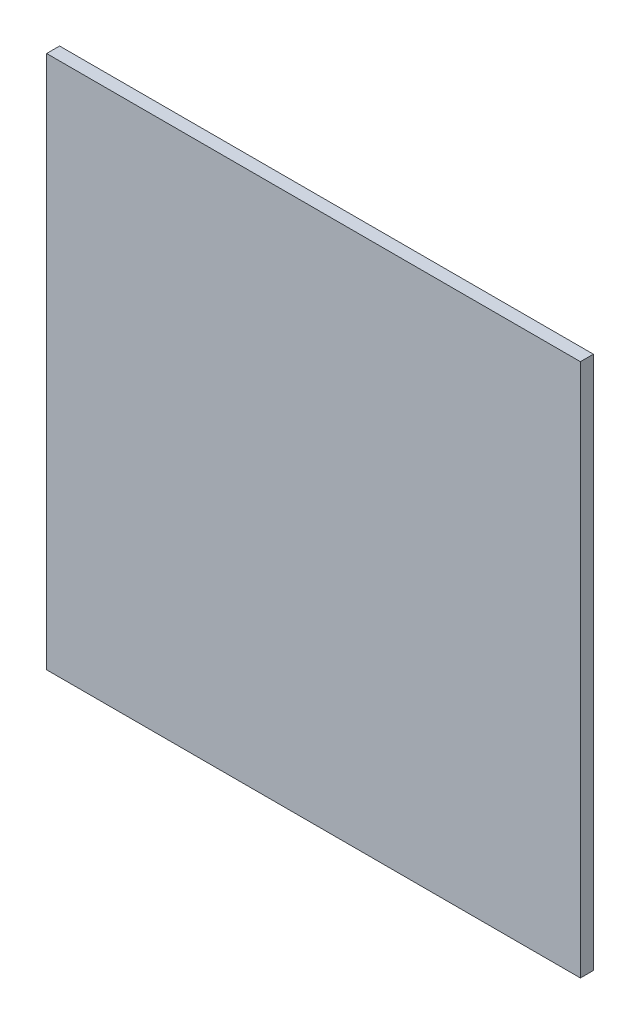
ISO-10303-21;
HEADER;
FILE_DESCRIPTION(('STEP AP214'),'2;1');
FILE_NAME('part.step','',(''),(''),'','','');
FILE_SCHEMA(('AUTOMOTIVE_DESIGN { 1 0 10303 214 1 1 1 1 }'));
ENDSEC;
DATA;
#1=APPLICATION_CONTEXT('core data for automotive mechanical design processes');
#2=APPLICATION_PROTOCOL_DEFINITION('international standard','automotive_design',2000,#1);
#3=PRODUCT_CONTEXT('',#1,'mechanical');
#4=PRODUCT('Part','Part','',(#3));
#5=PRODUCT_RELATED_PRODUCT_CATEGORY('part','',(#4));
#6=PRODUCT_DEFINITION_FORMATION('','',#4);
#7=PRODUCT_DEFINITION_CONTEXT('part definition',#1,'design');
#8=PRODUCT_DEFINITION('design','',#6,#7);
#9=PRODUCT_DEFINITION_SHAPE('','',#8);
#10=(LENGTH_UNIT() NAMED_UNIT(*) SI_UNIT(.MILLI.,.METRE.));
#11=(NAMED_UNIT(*) PLANE_ANGLE_UNIT() SI_UNIT($,.RADIAN.));
#12=(NAMED_UNIT(*) SI_UNIT($,.STERADIAN.) SOLID_ANGLE_UNIT());
#13=UNCERTAINTY_MEASURE_WITH_UNIT(LENGTH_MEASURE(1.E-05),#10,'distance_accuracy_value','');
#14=(GEOMETRIC_REPRESENTATION_CONTEXT(3) GLOBAL_UNCERTAINTY_ASSIGNED_CONTEXT((#13)) GLOBAL_UNIT_ASSIGNED_CONTEXT((#10,
#11,#12)) REPRESENTATION_CONTEXT('',''));
#15=CARTESIAN_POINT('',(0.,0.,0.));
#16=DIRECTION('',(0.,0.,1.));
#17=DIRECTION('',(1.,0.,0.));
#18=AXIS2_PLACEMENT_3D('',#15,#16,#17);
#19=CARTESIAN_POINT('',(0.,0.,11.1125));
#20=DIRECTION('',(1.,0.,0.));
#21=DIRECTION('',(0.,0.,-1.));
#22=AXIS2_PLACEMENT_3D('',#19,#20,#21);
#23=PLANE('',#22);
#24=DIRECTION('',(0.,-1.,0.));
#25=VECTOR('',#24,1.);
#26=CARTESIAN_POINT('',(0.,0.,0.));
#27=LINE('',#26,#25);
#28=CARTESIAN_POINT('',(0.,457.2,0.));
#29=VERTEX_POINT('',#28);
#30=CARTESIAN_POINT('',(0.,0.,0.));
#31=VERTEX_POINT('',#30);
#32=EDGE_CURVE('E95',#29,#31,#27,.T.);
#33=ORIENTED_EDGE('',*,*,#32,.T.);
#34=DIRECTION('',(0.,0.,-1.));
#35=VECTOR('',#34,1.);
#36=CARTESIAN_POINT('',(0.,0.,11.1125));
#37=LINE('',#36,#35);
#38=CARTESIAN_POINT('',(0.,0.,11.1125));
#39=VERTEX_POINT('',#38);
#40=EDGE_CURVE('E11',#39,#31,#37,.T.);
#41=ORIENTED_EDGE('',*,*,#40,.F.);
#42=DIRECTION('',(0.,-1.,0.));
#43=VECTOR('',#42,1.);
#44=CARTESIAN_POINT('',(0.,0.,11.1125));
#45=LINE('',#44,#43);
#46=CARTESIAN_POINT('',(0.,457.2,11.1125));
#47=VERTEX_POINT('',#46);
#48=EDGE_CURVE('E83',#47,#39,#45,.T.);
#49=ORIENTED_EDGE('',*,*,#48,.F.);
#50=DIRECTION('',(0.,0.,-1.));
#51=VECTOR('',#50,1.);
#52=CARTESIAN_POINT('',(0.,457.2,11.1125));
#53=LINE('',#52,#51);
#54=EDGE_CURVE('E91',#47,#29,#53,.T.);
#55=ORIENTED_EDGE('',*,*,#54,.T.);
#56=EDGE_LOOP('',(#33,#41,#49,#55));
#57=FACE_BOUND('',#56,.T.);
#58=ADVANCED_FACE('F32',(#57),#23,.F.);
#59=CARTESIAN_POINT('',(0.,0.,11.1125));
#60=DIRECTION('',(0.,1.,0.));
#61=DIRECTION('',(0.,0.,1.));
#62=AXIS2_PLACEMENT_3D('',#59,#60,#61);
#63=PLANE('',#62);
#64=DIRECTION('',(1.,0.,0.));
#65=VECTOR('',#64,1.);
#66=CARTESIAN_POINT('',(0.,0.,0.));
#67=LINE('',#66,#65);
#68=CARTESIAN_POINT('',(457.2,0.,0.));
#69=VERTEX_POINT('',#68);
#70=EDGE_CURVE('E87',#31,#69,#67,.T.);
#71=ORIENTED_EDGE('',*,*,#70,.T.);
#72=DIRECTION('',(0.,0.,-1.));
#73=VECTOR('',#72,1.);
#74=CARTESIAN_POINT('',(457.2,0.,11.1125));
#75=LINE('',#74,#73);
#76=CARTESIAN_POINT('',(457.2,0.,11.1125));
#77=VERTEX_POINT('',#76);
#78=EDGE_CURVE('E40',#77,#69,#75,.T.);
#79=ORIENTED_EDGE('',*,*,#78,.F.);
#80=DIRECTION('',(1.,0.,0.));
#81=VECTOR('',#80,1.);
#82=CARTESIAN_POINT('',(0.,0.,11.1125));
#83=LINE('',#82,#81);
#84=EDGE_CURVE('E78',#39,#77,#83,.T.);
#85=ORIENTED_EDGE('',*,*,#84,.F.);
#86=ORIENTED_EDGE('',*,*,#40,.T.);
#87=EDGE_LOOP('',(#71,#79,#85,#86));
#88=FACE_BOUND('',#87,.T.);
#89=ADVANCED_FACE('F86',(#88),#63,.F.);
#90=CARTESIAN_POINT('',(457.2,0.,11.1125));
#91=DIRECTION('',(-1.,0.,0.));
#92=DIRECTION('',(0.,-1.,0.));
#93=AXIS2_PLACEMENT_3D('',#90,#91,#92);
#94=PLANE('',#93);
#95=DIRECTION('',(0.,1.,0.));
#96=VECTOR('',#95,1.);
#97=CARTESIAN_POINT('',(457.2,0.,0.));
#98=LINE('',#97,#96);
#99=CARTESIAN_POINT('',(457.2,457.2,0.));
#100=VERTEX_POINT('',#99);
#101=EDGE_CURVE('E65',#69,#100,#98,.T.);
#102=ORIENTED_EDGE('',*,*,#101,.T.);
#103=DIRECTION('',(0.,0.,-1.));
#104=VECTOR('',#103,1.);
#105=CARTESIAN_POINT('',(457.2,457.2,11.1125));
#106=LINE('',#105,#104);
#107=CARTESIAN_POINT('',(457.2,457.2,11.1125));
#108=VERTEX_POINT('',#107);
#109=EDGE_CURVE('E88',#108,#100,#106,.T.);
#110=ORIENTED_EDGE('',*,*,#109,.F.);
#111=DIRECTION('',(0.,1.,0.));
#112=VECTOR('',#111,1.);
#113=CARTESIAN_POINT('',(457.2,0.,11.1125));
#114=LINE('',#113,#112);
#115=EDGE_CURVE('E81',#77,#108,#114,.T.);
#116=ORIENTED_EDGE('',*,*,#115,.F.);
#117=ORIENTED_EDGE('',*,*,#78,.T.);
#118=EDGE_LOOP('',(#102,#110,#116,#117));
#119=FACE_BOUND('',#118,.T.);
#120=ADVANCED_FACE('F89',(#119),#94,.F.);
#121=CARTESIAN_POINT('',(0.,457.2,11.1125));
#122=DIRECTION('',(0.,-1.,0.));
#123=DIRECTION('',(1.,0.,0.));
#124=AXIS2_PLACEMENT_3D('',#121,#122,#123);
#125=PLANE('',#124);
#126=DIRECTION('',(-1.,0.,0.));
#127=VECTOR('',#126,1.);
#128=CARTESIAN_POINT('',(0.,457.2,0.));
#129=LINE('',#128,#127);
#130=EDGE_CURVE('E71',#100,#29,#129,.T.);
#131=ORIENTED_EDGE('',*,*,#130,.T.);
#132=ORIENTED_EDGE('',*,*,#54,.F.);
#133=DIRECTION('',(-1.,0.,0.));
#134=VECTOR('',#133,1.);
#135=CARTESIAN_POINT('',(0.,457.2,11.1125));
#136=LINE('',#135,#134);
#137=EDGE_CURVE('E48',#108,#47,#136,.T.);
#138=ORIENTED_EDGE('',*,*,#137,.F.);
#139=ORIENTED_EDGE('',*,*,#109,.T.);
#140=EDGE_LOOP('',(#131,#132,#138,#139));
#141=FACE_BOUND('',#140,.T.);
#142=ADVANCED_FACE('F102',(#141),#125,.F.);
#143=CARTESIAN_POINT('',(0.,0.,11.1125));
#144=DIRECTION('',(0.,0.,-1.));
#145=DIRECTION('',(-1.,0.,0.));
#146=AXIS2_PLACEMENT_3D('',#143,#144,#145);
#147=PLANE('',#146);
#148=ORIENTED_EDGE('',*,*,#48,.T.);
#149=ORIENTED_EDGE('',*,*,#84,.T.);
#150=ORIENTED_EDGE('',*,*,#115,.T.);
#151=ORIENTED_EDGE('',*,*,#137,.T.);
#152=EDGE_LOOP('',(#148,#149,#150,#151));
#153=FACE_BOUND('',#152,.T.);
#154=ADVANCED_FACE('F79',(#153),#147,.F.);
#155=CARTESIAN_POINT('',(0.,0.,0.));
#156=DIRECTION('',(0.,0.,-1.));
#157=DIRECTION('',(-1.,0.,0.));
#158=AXIS2_PLACEMENT_3D('',#155,#156,#157);
#159=PLANE('',#158);
#160=ORIENTED_EDGE('',*,*,#32,.F.);
#161=ORIENTED_EDGE('',*,*,#130,.F.);
#162=ORIENTED_EDGE('',*,*,#101,.F.);
#163=ORIENTED_EDGE('',*,*,#70,.F.);
#164=EDGE_LOOP('',(#160,#161,#162,#163));
#165=FACE_BOUND('',#164,.T.);
#166=ADVANCED_FACE('F105',(#165),#159,.T.);
#167=CLOSED_SHELL('',(#58,#89,#120,#142,#154,#166));
#168=MANIFOLD_SOLID_BREP('B2',#167);
#169=ADVANCED_BREP_SHAPE_REPRESENTATION('',(#18,#168),#14);
#170=SHAPE_DEFINITION_REPRESENTATION(#9,#169);
ENDSEC;
END-ISO-10303-21;
